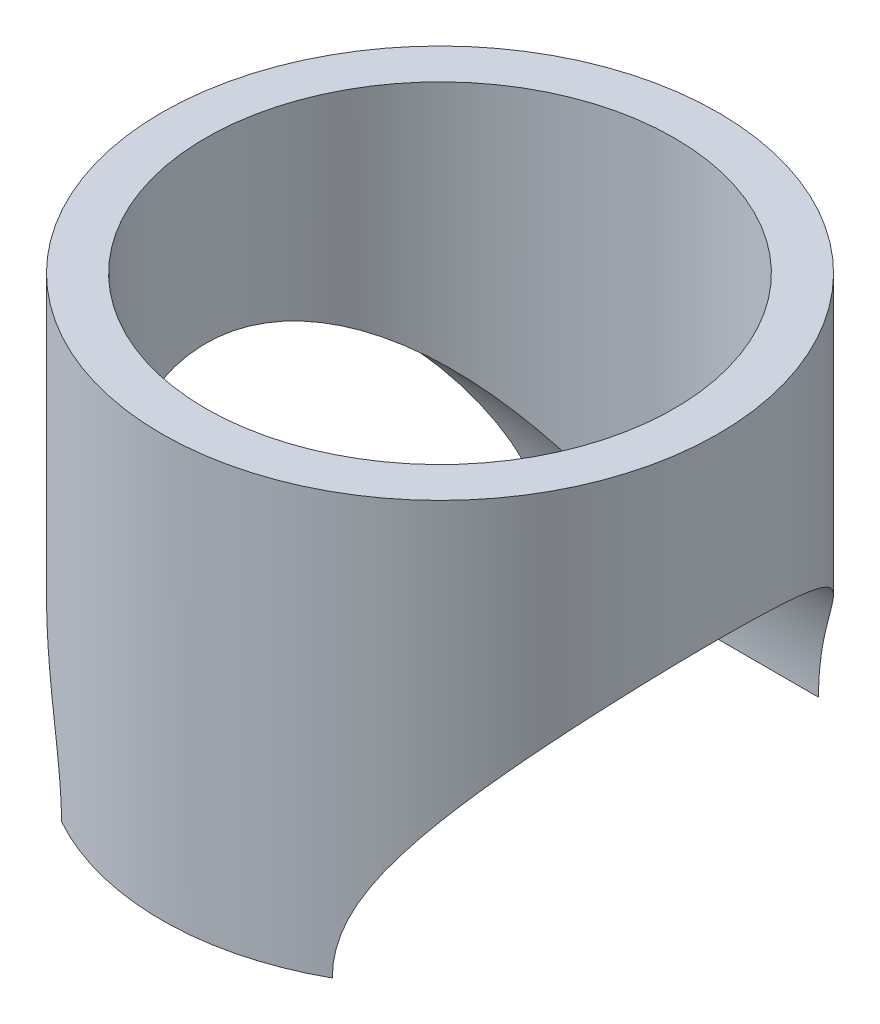
ISO-10303-21;
HEADER;
FILE_DESCRIPTION(('STEP AP214'),'2;1');
FILE_NAME('part.step','',(''),(''),'','','');
FILE_SCHEMA(('AUTOMOTIVE_DESIGN { 1 0 10303 214 1 1 1 1 }'));
ENDSEC;
DATA;
#1=APPLICATION_CONTEXT('core data for automotive mechanical design processes');
#2=APPLICATION_PROTOCOL_DEFINITION('international standard','automotive_design',2000,#1);
#3=PRODUCT_CONTEXT('',#1,'mechanical');
#4=PRODUCT('Part','Part','',(#3));
#5=PRODUCT_RELATED_PRODUCT_CATEGORY('part','',(#4));
#6=PRODUCT_DEFINITION_FORMATION('','',#4);
#7=PRODUCT_DEFINITION_CONTEXT('part definition',#1,'design');
#8=PRODUCT_DEFINITION('design','',#6,#7);
#9=PRODUCT_DEFINITION_SHAPE('','',#8);
#10=(LENGTH_UNIT() NAMED_UNIT(*) SI_UNIT(.MILLI.,.METRE.));
#11=(NAMED_UNIT(*) PLANE_ANGLE_UNIT() SI_UNIT($,.RADIAN.));
#12=(NAMED_UNIT(*) SI_UNIT($,.STERADIAN.) SOLID_ANGLE_UNIT());
#13=UNCERTAINTY_MEASURE_WITH_UNIT(LENGTH_MEASURE(1.E-05),#10,'distance_accuracy_value','');
#14=(GEOMETRIC_REPRESENTATION_CONTEXT(3) GLOBAL_UNCERTAINTY_ASSIGNED_CONTEXT((#13)) GLOBAL_UNIT_ASSIGNED_CONTEXT((#10,
#11,#12)) REPRESENTATION_CONTEXT('',''));
#15=CARTESIAN_POINT('',(0.,0.,0.));
#16=DIRECTION('',(0.,0.,1.));
#17=DIRECTION('',(1.,0.,0.));
#18=AXIS2_PLACEMENT_3D('',#15,#16,#17);
#19=CARTESIAN_POINT('',(0.,-18.25625,0.));
#20=DIRECTION('',(0.,1.,0.));
#21=DIRECTION('',(0.,0.,1.));
#22=AXIS2_PLACEMENT_3D('',#19,#20,#21);
#23=PLANE('',#22);
#24=CARTESIAN_POINT('',(0.,-18.25625,0.));
#25=DIRECTION('',(0.,1.,0.));
#26=DIRECTION('',(0.,0.,1.));
#27=AXIS2_PLACEMENT_3D('',#24,#25,#26);
#28=CIRCLE('',#27,24.13);
#29=CARTESIAN_POINT('',(11.739087528424,-18.25625,-21.082));
#30=VERTEX_POINT('',#29);
#31=CARTESIAN_POINT('',(-11.739087528424,-18.25625,-21.082));
#32=VERTEX_POINT('',#31);
#33=EDGE_CURVE('E56',#30,#32,#28,.T.);
#34=ORIENTED_EDGE('',*,*,#33,.F.);
#35=DIRECTION('',(1.,0.,0.));
#36=VECTOR('',#35,1.);
#37=CARTESIAN_POINT('',(0.,-18.25625,-21.082));
#38=LINE('',#37,#36);
#39=EDGE_CURVE('E69',#30,#32,#38,.F.);
#40=ORIENTED_EDGE('',*,*,#39,.T.);
#41=EDGE_LOOP('',(#34,#40));
#42=FACE_BOUND('',#41,.T.);
#43=ADVANCED_FACE('F35',(#42),#23,.F.);
#44=CARTESIAN_POINT('',(0.,18.25625,0.));
#45=DIRECTION('',(0.,1.,0.));
#46=DIRECTION('',(0.,0.,1.));
#47=AXIS2_PLACEMENT_3D('',#44,#45,#46);
#48=PLANE('',#47);
#49=CARTESIAN_POINT('',(0.,18.25625,0.));
#50=DIRECTION('',(0.,1.,0.));
#51=DIRECTION('',(0.,0.,1.));
#52=AXIS2_PLACEMENT_3D('',#49,#50,#51);
#53=CIRCLE('',#52,24.13);
#54=CARTESIAN_POINT('',(0.,18.25625,24.13));
#55=VERTEX_POINT('',#54);
#56=EDGE_CURVE('E49',#55,#55,#53,.T.);
#57=ORIENTED_EDGE('',*,*,#56,.T.);
#58=EDGE_LOOP('',(#57));
#59=FACE_BOUND('',#58,.T.);
#60=CARTESIAN_POINT('',(0.,18.25625,0.));
#61=DIRECTION('',(0.,1.,0.));
#62=DIRECTION('',(0.,0.,1.));
#63=AXIS2_PLACEMENT_3D('',#60,#61,#62);
#64=CIRCLE('',#63,20.32);
#65=CARTESIAN_POINT('',(0.,18.25625,20.32));
#66=VERTEX_POINT('',#65);
#67=EDGE_CURVE('E80',#66,#66,#64,.T.);
#68=ORIENTED_EDGE('',*,*,#67,.F.);
#69=EDGE_LOOP('',(#68));
#70=FACE_BOUND('',#69,.T.);
#71=ADVANCED_FACE('F105',(#59,#70),#48,.T.);
#72=DIRECTION('',(1.,0.,0.));
#73=VECTOR('',#72,1.);
#74=CARTESIAN_POINT('',(0.,-18.25625,21.082));
#75=LINE('',#74,#73);
#76=CARTESIAN_POINT('',(-11.739087528424,-18.25625,21.082));
#77=VERTEX_POINT('',#76);
#78=CARTESIAN_POINT('',(11.739087528424,-18.25625,21.082));
#79=VERTEX_POINT('',#78);
#80=EDGE_CURVE('E63',#77,#79,#75,.T.);
#81=ORIENTED_EDGE('',*,*,#80,.T.);
#82=EDGE_CURVE('E78',#77,#79,#28,.T.);
#83=ORIENTED_EDGE('',*,*,#82,.F.);
#84=EDGE_LOOP('',(#81,#83));
#85=FACE_BOUND('',#84,.T.);
#86=ADVANCED_FACE('F107',(#85),#23,.F.);
#87=CARTESIAN_POINT('',(0.,18.25625,0.));
#88=DIRECTION('',(0.,-1.,0.));
#89=DIRECTION('',(0.,0.,-1.));
#90=AXIS2_PLACEMENT_3D('',#87,#88,#89);
#91=CYLINDRICAL_SURFACE('',#90,24.13);
#92=ORIENTED_EDGE('',*,*,#56,.F.);
#93=EDGE_LOOP('',(#92));
#94=FACE_BOUND('',#93,.T.);
#95=ORIENTED_EDGE('',*,*,#82,.T.);
#96=CARTESIAN_POINT('',(11.739087528424,-18.25625,21.082));
#97=CARTESIAN_POINT('',(11.7390735991911,-18.08407407303,21.0820033956179));
#98=CARTESIAN_POINT('',(11.7428775245086,-17.9119284080734,21.0798900670036));
#99=CARTESIAN_POINT('',(11.7579884747208,-17.5680994761874,21.0714669377096));
#100=CARTESIAN_POINT('',(11.7692941595323,-17.3964161321697,21.0651578865359));
#101=CARTESIAN_POINT('',(11.8141910028188,-16.8834391279661,21.040034025855));
#102=CARTESIAN_POINT('',(11.8587633128905,-16.543341097433,21.0150221015338));
#103=CARTESIAN_POINT('',(11.9737048677594,-15.8750339752899,20.9497376890227));
#104=CARTESIAN_POINT('',(12.0436335160157,-15.5467212428461,20.909725468668));
#105=CARTESIAN_POINT('',(12.2060359880762,-14.8976845627344,20.8153404861012));
#106=CARTESIAN_POINT('',(12.2985245072683,-14.5769657116835,20.7609583614737));
#107=CARTESIAN_POINT('',(12.5484251271962,-13.8013732186979,20.6112485337628));
#108=CARTESIAN_POINT('',(12.7162968837642,-13.3513025005434,20.5085195345175));
#109=CARTESIAN_POINT('',(13.0814490845255,-12.4701267720358,20.2775553309992));
#110=CARTESIAN_POINT('',(13.2787435684613,-12.039030943883,20.14930794021));
#111=CARTESIAN_POINT('',(13.6961533726555,-11.1911359828143,19.8679700881986));
#112=CARTESIAN_POINT('',(13.9164644077948,-10.7745077303363,19.714659039238));
#113=CARTESIAN_POINT('',(14.3715808518282,-9.95861330201741,19.3853933315258));
#114=CARTESIAN_POINT('',(14.6063854155648,-9.55934611611482,19.2094399924607));
#115=CARTESIAN_POINT('',(15.0351878436054,-8.85888917974106,18.8747921840822));
#116=CARTESIAN_POINT('',(15.2274436243599,-8.55465866664908,18.7201903507985));
#117=CARTESIAN_POINT('',(15.615749993839,-7.95589421440815,18.3975278906171));
#118=CARTESIAN_POINT('',(15.8118009645401,-7.66136125943689,18.2294659035912));
#119=CARTESIAN_POINT('',(16.4031186599564,-6.79162031883522,17.7051357024082));
#120=CARTESIAN_POINT('',(16.8014559261532,-6.23042092901618,17.3287955231726));
#121=CARTESIAN_POINT('',(17.5935759198042,-5.14657597181105,16.5239648376673));
#122=CARTESIAN_POINT('',(17.9873679374965,-4.62383191492748,16.0956155727483));
#123=CARTESIAN_POINT('',(18.7620280565222,-3.61689060282745,15.1855208236601));
#124=CARTESIAN_POINT('',(19.142901838275,-3.13267627581971,14.7037992166734));
#125=CARTESIAN_POINT('',(19.7979937394125,-2.31259208230997,13.8033060115728));
#126=CARTESIAN_POINT('',(20.0766187768359,-1.96819152161001,13.3954826047861));
#127=CARTESIAN_POINT('',(20.6170322702882,-1.30655085934945,12.5478087141213));
#128=CARTESIAN_POINT('',(20.8788211700136,-0.989310041952961,12.1079590749085));
#129=CARTESIAN_POINT('',(21.3811440106904,-0.385177021028827,11.1970391769103));
#130=CARTESIAN_POINT('',(21.6217005084017,-0.0982525447157852,10.7260030044625));
#131=CARTESIAN_POINT('',(21.9634627085038,0.306959834283379,9.99676525436779));
#132=CARTESIAN_POINT('',(22.074200527265,0.437830046209029,9.7499160274075));
#133=CARTESIAN_POINT('',(22.2888283168124,0.690786093225204,9.24874897262869));
#134=CARTESIAN_POINT('',(22.3927165090234,0.812869647518544,8.99442922960148));
#135=CARTESIAN_POINT('',(22.6557598724382,1.12124272779861,8.31719373048579));
#136=CARTESIAN_POINT('',(22.8088160044349,1.29990149644173,7.88836839092437));
#137=CARTESIAN_POINT('',(23.0928338791217,1.63042748467382,7.01351531469732));
#138=CARTESIAN_POINT('',(23.2238001390804,1.78230018217138,6.56749111808858));
#139=CARTESIAN_POINT('',(23.4613695200211,2.05715593136349,5.66044959105592));
#140=CARTESIAN_POINT('',(23.5679822167315,2.1801503384237,5.19943823525703));
#141=CARTESIAN_POINT('',(23.7548637062547,2.39538979797867,4.26501387511208));
#142=CARTESIAN_POINT('',(23.8351322079308,2.48763451065056,3.791600733773));
#143=CARTESIAN_POINT('',(23.9680076717743,2.64017622817548,2.83315766499687));
#144=CARTESIAN_POINT('',(24.0204651423892,2.70030059076089,2.34807932105807));
#145=CARTESIAN_POINT('',(24.0958936412044,2.78671462776825,1.37262187745551));
#146=CARTESIAN_POINT('',(24.1188646023565,2.81300422525463,0.882242765741078));
#147=CARTESIAN_POINT('',(24.1347883831059,2.83123097137466,-0.0995719725427617));
#148=CARTESIAN_POINT('',(24.1277454676267,2.82317300074236,-0.59100743908707));
#149=CARTESIAN_POINT('',(24.0838129836678,2.77287321380192,-1.57075843632448));
#150=CARTESIAN_POINT('',(24.046924979396,2.730633189006,-2.05907412917589));
#151=CARTESIAN_POINT('',(23.9485083643139,2.61779042171497,-2.98747550538334));
#152=CARTESIAN_POINT('',(23.8893296033681,2.54989091094967,-3.42814511096225));
#153=CARTESIAN_POINT('',(23.7477698443778,2.38719943436388,-4.30065532684726));
#154=CARTESIAN_POINT('',(23.6653904470208,2.29240932381025,-4.73249654404878));
#155=CARTESIAN_POINT('',(23.4788321311074,2.07727528630051,-5.58495844876746));
#156=CARTESIAN_POINT('',(23.3746515218667,1.95692937748145,-6.00557826321081));
#157=CARTESIAN_POINT('',(23.1461387876345,1.69223427108215,-6.83356769686585));
#158=CARTESIAN_POINT('',(23.0218054185968,1.54788359165367,-7.24093649621643));
#159=CARTESIAN_POINT('',(22.7456021652489,1.2261398431218,-8.0683039057928));
#160=CARTESIAN_POINT('',(22.5924274017339,1.04715813372704,-8.48724779671844));
#161=CARTESIAN_POINT('',(22.2673789975177,0.665693744031697,-9.30672224437815));
#162=CARTESIAN_POINT('',(22.0955050238618,0.463210645265515,-9.70725247306132));
#163=CARTESIAN_POINT('',(21.7352637750987,0.0366060825356913,-10.4890666599843));
#164=CARTESIAN_POINT('',(21.5468908942153,-0.187522738595435,-10.8703440068291));
#165=CARTESIAN_POINT('',(21.1559090574181,-0.655600764159128,-11.6129492644716));
#166=CARTESIAN_POINT('',(20.9532971606271,-0.899554064707212,-11.9742730264431));
#167=CARTESIAN_POINT('',(20.4283285028445,-1.53627061071713,-12.857822369502));
#168=CARTESIAN_POINT('',(20.0981131136747,-1.94088524276709,-13.3669087963575));
#169=CARTESIAN_POINT('',(19.4171168179919,-2.78751979392966,-14.3382207585271));
#170=CARTESIAN_POINT('',(19.0663264434196,-3.22955697604914,-14.8004244483688));
#171=CARTESIAN_POINT('',(18.3504579632687,-4.14892420714467,-15.6792711924517));
#172=CARTESIAN_POINT('',(17.9853453799674,-4.62634223806346,-16.0957938142865));
#173=CARTESIAN_POINT('',(17.2492225520943,-5.6135470593565,-16.882271969802));
#174=CARTESIAN_POINT('',(16.878213912849,-6.1233251484868,-17.2522399423612));
#175=CARTESIAN_POINT('',(16.1928125714475,-7.0981656749566,-17.8951682454679));
#176=CARTESIAN_POINT('',(15.878076524012,-7.55886167034416,-18.1744024144448));
#177=CARTESIAN_POINT('',(15.256825362399,-8.5047407678277,-18.698968527221));
#178=CARTESIAN_POINT('',(14.9503124668056,-8.98993037848372,-18.944291394521));
#179=CARTESIAN_POINT('',(14.3546359423477,-9.98531509123404,-19.3995164604927));
#180=CARTESIAN_POINT('',(14.065432574079,-10.495447614902,-19.6095019682124));
#181=CARTESIAN_POINT('',(13.6529179816347,-11.2816261140679,-19.8968072202025));
#182=CARTESIAN_POINT('',(13.5190022183166,-11.5470911566672,-19.9879379518083));
#183=CARTESIAN_POINT('',(13.2600944866233,-12.0853732702324,-20.1606308855133));
#184=CARTESIAN_POINT('',(13.1351041264938,-12.3581916540404,-20.2421913648677));
#185=CARTESIAN_POINT('',(12.747458743117,-13.2557469080203,-20.490487427798));
#186=CARTESIAN_POINT('',(12.5067493342205,-13.8965014440883,-20.6371170384919));
#187=CARTESIAN_POINT('',(12.2101050282709,-14.8830900866602,-20.8130643312883));
#188=CARTESIAN_POINT('',(12.1220620285236,-15.2155691231136,-20.8643271503547));
#189=CARTESIAN_POINT('',(11.9710882109104,-15.888124681314,-20.9513124087923));
#190=CARTESIAN_POINT('',(11.9081413380531,-16.2281961983066,-20.9870447849298));
#191=CARTESIAN_POINT('',(11.8199438741503,-16.8489697363104,-21.0368249538532));
#192=CARTESIAN_POINT('',(11.7898196611475,-17.1287570685328,-21.0536932955336));
#193=CARTESIAN_POINT('',(11.7492929221813,-17.6910754620512,-21.0763171033168));
#194=CARTESIAN_POINT('',(11.7389525984072,-17.9736123790282,-21.0820375204629));
#195=CARTESIAN_POINT('',(11.739087528424,-18.25625,-21.082));
#196=B_SPLINE_CURVE_WITH_KNOTS('',3,(#96,#97,#98,#99,#100,#101,#102,#103,#104,#105,#106,#107,
#108,#109,#110,#111,#112,#113,#114,#115,#116,#117,#118,#119,#120,#121,#122,#123,#124,#125,#126,
#127,#128,#129,#130,#131,#132,#133,#134,#135,#136,#137,#138,#139,#140,#141,#142,#143,#144,#145,
#146,#147,#148,#149,#150,#151,#152,#153,#154,#155,#156,#157,#158,#159,#160,#161,#162,#163,#164,
#165,#166,#167,#168,#169,#170,#171,#172,#173,#174,#175,#176,#177,#178,#179,#180,#181,#182,#183,
#184,#185,#186,#187,#188,#189,#190,#191,#192,#193,#194,#195),.UNSPECIFIED.,.F.,.F.,(4,2,2,2,2,2,
2,2,2,2,2,2,2,2,2,2,2,2,2,2,2,2,2,2,2,2,2,2,2,2,2,2,2,2,2,2,2,2,2,2,2,2,2,2,2,2,2,2,2,4),(0.,
0.516414774766779,1.03273732417139,2.06276206676861,3.07568518591108,4.08926988849761,
5.56045256298501,7.03233950631079,8.51795690508985,10.0034877551208,11.1781755276448,
12.3529821507218,14.7031691082531,17.0471107031818,19.390007891152,21.1948722669283,
22.9996890581353,24.802564780825,25.7039285991681,26.6055255514872,28.071339885437,
29.5368541032964,31.0017910908485,32.4667442672644,33.9394940960529,35.4122472736656,
36.8847911824043,38.3572579187905,39.7050947911592,41.0528386946392,42.4006871544234,
43.7486188496975,45.1891451440145,46.6296970922703,48.0707404047464,49.5120822250155,
51.6968835037557,53.8826981801523,56.0741435666265,58.2650021746245,60.1353967072175,
62.0062908932544,63.8727106398916,64.8053050988661,65.7380671778323,67.829964425309,
68.8721351756851,69.9136381339799,70.7584804344512,71.6059746520517),.UNSPECIFIED.);
#197=EDGE_CURVE('E72',#79,#30,#196,.T.);
#198=ORIENTED_EDGE('',*,*,#197,.T.);
#199=ORIENTED_EDGE('',*,*,#33,.T.);
#200=CARTESIAN_POINT('',(-11.739087528424,-18.25625,-21.082));
#201=CARTESIAN_POINT('',(-11.7390735991911,-18.08407407303,-21.0820033956179));
#202=CARTESIAN_POINT('',(-11.7428775245086,-17.9119284080734,-21.0798900670036));
#203=CARTESIAN_POINT('',(-11.7579884747208,-17.5680994761874,-21.0714669377096));
#204=CARTESIAN_POINT('',(-11.7692941595323,-17.3964161321697,-21.0651578865359));
#205=CARTESIAN_POINT('',(-11.8141910028188,-16.8834391279661,-21.040034025855));
#206=CARTESIAN_POINT('',(-11.8587633128905,-16.543341097433,-21.0150221015338));
#207=CARTESIAN_POINT('',(-11.9737048677594,-15.8750339752899,-20.9497376890227));
#208=CARTESIAN_POINT('',(-12.0436335160157,-15.5467212428461,-20.909725468668));
#209=CARTESIAN_POINT('',(-12.2060359880762,-14.8976845627344,-20.8153404861012));
#210=CARTESIAN_POINT('',(-12.2985245072683,-14.5769657116835,-20.7609583614737));
#211=CARTESIAN_POINT('',(-12.5484251271962,-13.8013732186979,-20.6112485337628));
#212=CARTESIAN_POINT('',(-12.7162968837642,-13.3513025005434,-20.5085195345175));
#213=CARTESIAN_POINT('',(-13.0814490845255,-12.4701267720358,-20.2775553309992));
#214=CARTESIAN_POINT('',(-13.2787435684613,-12.039030943883,-20.14930794021));
#215=CARTESIAN_POINT('',(-13.6961533726555,-11.1911359828143,-19.8679700881986));
#216=CARTESIAN_POINT('',(-13.9164644077948,-10.7745077303363,-19.714659039238));
#217=CARTESIAN_POINT('',(-14.3715808518282,-9.95861330201741,-19.3853933315258));
#218=CARTESIAN_POINT('',(-14.6063854155648,-9.55934611611482,-19.2094399924607));
#219=CARTESIAN_POINT('',(-15.0351878436054,-8.85888917974106,-18.8747921840822));
#220=CARTESIAN_POINT('',(-15.2274436243599,-8.55465866664908,-18.7201903507985));
#221=CARTESIAN_POINT('',(-15.615749993839,-7.95589421440815,-18.3975278906171));
#222=CARTESIAN_POINT('',(-15.8118009645401,-7.66136125943689,-18.2294659035912));
#223=CARTESIAN_POINT('',(-16.4031186599564,-6.79162031883522,-17.7051357024082));
#224=CARTESIAN_POINT('',(-16.8014559261532,-6.23042092901618,-17.3287955231726));
#225=CARTESIAN_POINT('',(-17.5935759198042,-5.14657597181105,-16.5239648376673));
#226=CARTESIAN_POINT('',(-17.9873679374965,-4.62383191492748,-16.0956155727483));
#227=CARTESIAN_POINT('',(-18.7620280565222,-3.61689060282745,-15.1855208236601));
#228=CARTESIAN_POINT('',(-19.142901838275,-3.13267627581971,-14.7037992166734));
#229=CARTESIAN_POINT('',(-19.7979937394125,-2.31259208230997,-13.8033060115728));
#230=CARTESIAN_POINT('',(-20.0766187768359,-1.96819152161001,-13.3954826047861));
#231=CARTESIAN_POINT('',(-20.6170322702882,-1.30655085934945,-12.5478087141213));
#232=CARTESIAN_POINT('',(-20.8788211700136,-0.989310041952961,-12.1079590749085));
#233=CARTESIAN_POINT('',(-21.3811440106904,-0.385177021028827,-11.1970391769103));
#234=CARTESIAN_POINT('',(-21.6217005084017,-0.0982525447157852,-10.7260030044625));
#235=CARTESIAN_POINT('',(-21.9634627085038,0.306959834283379,-9.99676525436779));
#236=CARTESIAN_POINT('',(-22.074200527265,0.437830046209029,-9.7499160274075));
#237=CARTESIAN_POINT('',(-22.2888283168124,0.690786093225204,-9.24874897262869));
#238=CARTESIAN_POINT('',(-22.3927165090234,0.812869647518544,-8.99442922960148));
#239=CARTESIAN_POINT('',(-22.6557598724382,1.12124272779861,-8.31719373048579));
#240=CARTESIAN_POINT('',(-22.8088160044349,1.29990149644173,-7.88836839092437));
#241=CARTESIAN_POINT('',(-23.0928338791217,1.63042748467382,-7.01351531469732));
#242=CARTESIAN_POINT('',(-23.2238001390804,1.78230018217138,-6.56749111808858));
#243=CARTESIAN_POINT('',(-23.4613695200211,2.05715593136349,-5.66044959105592));
#244=CARTESIAN_POINT('',(-23.5679822167315,2.1801503384237,-5.19943823525703));
#245=CARTESIAN_POINT('',(-23.7548637062547,2.39538979797867,-4.26501387511208));
#246=CARTESIAN_POINT('',(-23.8351322079308,2.48763451065056,-3.791600733773));
#247=CARTESIAN_POINT('',(-23.9680076717743,2.64017622817548,-2.83315766499687));
#248=CARTESIAN_POINT('',(-24.0204651423892,2.70030059076089,-2.34807932105807));
#249=CARTESIAN_POINT('',(-24.0958936412044,2.78671462776825,-1.37262187745551));
#250=CARTESIAN_POINT('',(-24.1188646023565,2.81300422525463,-0.882242765741078));
#251=CARTESIAN_POINT('',(-24.1347883831059,2.83123097137466,0.0995719725427617));
#252=CARTESIAN_POINT('',(-24.1277454676267,2.82317300074236,0.59100743908707));
#253=CARTESIAN_POINT('',(-24.0838129836678,2.77287321380192,1.57075843632448));
#254=CARTESIAN_POINT('',(-24.046924979396,2.730633189006,2.05907412917589));
#255=CARTESIAN_POINT('',(-23.9485083643139,2.61779042171497,2.98747550538334));
#256=CARTESIAN_POINT('',(-23.8893296033681,2.54989091094967,3.42814511096225));
#257=CARTESIAN_POINT('',(-23.7477698443778,2.38719943436388,4.30065532684726));
#258=CARTESIAN_POINT('',(-23.6653904470208,2.29240932381025,4.73249654404878));
#259=CARTESIAN_POINT('',(-23.4788321311074,2.07727528630051,5.58495844876746));
#260=CARTESIAN_POINT('',(-23.3746515218667,1.95692937748145,6.00557826321081));
#261=CARTESIAN_POINT('',(-23.1461387876345,1.69223427108215,6.83356769686585));
#262=CARTESIAN_POINT('',(-23.0218054185968,1.54788359165367,7.24093649621643));
#263=CARTESIAN_POINT('',(-22.7456021652489,1.2261398431218,8.0683039057928));
#264=CARTESIAN_POINT('',(-22.5924274017339,1.04715813372704,8.48724779671844));
#265=CARTESIAN_POINT('',(-22.2673789975177,0.665693744031697,9.30672224437815));
#266=CARTESIAN_POINT('',(-22.0955050238618,0.463210645265515,9.70725247306132));
#267=CARTESIAN_POINT('',(-21.7352637750987,0.0366060825356913,10.4890666599843));
#268=CARTESIAN_POINT('',(-21.5468908942153,-0.187522738595435,10.8703440068291));
#269=CARTESIAN_POINT('',(-21.1559090574181,-0.655600764159128,11.6129492644716));
#270=CARTESIAN_POINT('',(-20.9532971606271,-0.899554064707212,11.9742730264431));
#271=CARTESIAN_POINT('',(-20.4283285028445,-1.53627061071713,12.857822369502));
#272=CARTESIAN_POINT('',(-20.0981131136747,-1.94088524276709,13.3669087963575));
#273=CARTESIAN_POINT('',(-19.4171168179919,-2.78751979392966,14.3382207585271));
#274=CARTESIAN_POINT('',(-19.0663264434196,-3.22955697604914,14.8004244483688));
#275=CARTESIAN_POINT('',(-18.3504579632687,-4.14892420714467,15.6792711924517));
#276=CARTESIAN_POINT('',(-17.9853453799674,-4.62634223806346,16.0957938142865));
#277=CARTESIAN_POINT('',(-17.2492225520943,-5.6135470593565,16.882271969802));
#278=CARTESIAN_POINT('',(-16.878213912849,-6.1233251484868,17.2522399423612));
#279=CARTESIAN_POINT('',(-16.1928125714475,-7.0981656749566,17.8951682454679));
#280=CARTESIAN_POINT('',(-15.878076524012,-7.55886167034416,18.1744024144448));
#281=CARTESIAN_POINT('',(-15.256825362399,-8.5047407678277,18.698968527221));
#282=CARTESIAN_POINT('',(-14.9503124668056,-8.98993037848372,18.944291394521));
#283=CARTESIAN_POINT('',(-14.3546359423477,-9.98531509123404,19.3995164604927));
#284=CARTESIAN_POINT('',(-14.065432574079,-10.495447614902,19.6095019682124));
#285=CARTESIAN_POINT('',(-13.6529179816347,-11.2816261140679,19.8968072202025));
#286=CARTESIAN_POINT('',(-13.5190022183166,-11.5470911566672,19.9879379518083));
#287=CARTESIAN_POINT('',(-13.2600944866233,-12.0853732702324,20.1606308855133));
#288=CARTESIAN_POINT('',(-13.1351041264938,-12.3581916540404,20.2421913648677));
#289=CARTESIAN_POINT('',(-12.747458743117,-13.2557469080203,20.490487427798));
#290=CARTESIAN_POINT('',(-12.5067493342205,-13.8965014440883,20.6371170384919));
#291=CARTESIAN_POINT('',(-12.2101050282709,-14.8830900866602,20.8130643312883));
#292=CARTESIAN_POINT('',(-12.1220620285236,-15.2155691231136,20.8643271503547));
#293=CARTESIAN_POINT('',(-11.9710882109104,-15.888124681314,20.9513124087923));
#294=CARTESIAN_POINT('',(-11.9081413380531,-16.2281961983066,20.9870447849298));
#295=CARTESIAN_POINT('',(-11.8199438741503,-16.8489697363104,21.0368249538532));
#296=CARTESIAN_POINT('',(-11.7898196611475,-17.1287570685328,21.0536932955336));
#297=CARTESIAN_POINT('',(-11.7492929221813,-17.6910754620512,21.0763171033168));
#298=CARTESIAN_POINT('',(-11.7389525984072,-17.9736123790282,21.0820375204629));
#299=CARTESIAN_POINT('',(-11.739087528424,-18.25625,21.082));
#300=B_SPLINE_CURVE_WITH_KNOTS('',3,(#200,#201,#202,#203,#204,#205,#206,#207,#208,#209,#210,
#211,#212,#213,#214,#215,#216,#217,#218,#219,#220,#221,#222,#223,#224,#225,#226,#227,#228,#229,
#230,#231,#232,#233,#234,#235,#236,#237,#238,#239,#240,#241,#242,#243,#244,#245,#246,#247,#248,
#249,#250,#251,#252,#253,#254,#255,#256,#257,#258,#259,#260,#261,#262,#263,#264,#265,#266,#267,
#268,#269,#270,#271,#272,#273,#274,#275,#276,#277,#278,#279,#280,#281,#282,#283,#284,#285,#286,
#287,#288,#289,#290,#291,#292,#293,#294,#295,#296,#297,#298,#299),.UNSPECIFIED.,.F.,.F.,(4,2,2,
2,2,2,2,2,2,2,2,2,2,2,2,2,2,2,2,2,2,2,2,2,2,2,2,2,2,2,2,2,2,2,2,2,2,2,2,2,2,2,2,2,2,2,2,2,2,4),
(0.,0.516414774766779,1.03273732417139,2.06276206676861,3.07568518591108,4.08926988849761,
5.56045256298501,7.03233950631079,8.51795690508985,10.0034877551208,11.1781755276448,
12.3529821507218,14.7031691082531,17.0471107031818,19.390007891152,21.1948722669283,
22.9996890581353,24.802564780825,25.7039285991681,26.6055255514872,28.071339885437,
29.5368541032964,31.0017910908485,32.4667442672644,33.9394940960529,35.4122472736656,
36.8847911824043,38.3572579187905,39.7050947911592,41.0528386946392,42.4006871544234,
43.7486188496975,45.1891451440145,46.6296970922703,48.0707404047464,49.5120822250155,
51.6968835037557,53.8826981801523,56.0741435666265,58.2650021746245,60.1353967072175,
62.0062908932544,63.8727106398916,64.8053050988661,65.7380671778323,67.829964425309,
68.8721351756851,69.9136381339799,70.7584804344512,71.6059746520517),.UNSPECIFIED.);
#301=EDGE_CURVE('E73',#32,#77,#300,.T.);
#302=ORIENTED_EDGE('',*,*,#301,.T.);
#303=EDGE_LOOP('',(#95,#198,#199,#302));
#304=FACE_BOUND('',#303,.T.);
#305=ADVANCED_FACE('F37',(#94,#304),#91,.T.);
#306=CARTESIAN_POINT('',(0.,18.25625,0.));
#307=DIRECTION('',(0.,-1.,0.));
#308=DIRECTION('',(0.,0.,-1.));
#309=AXIS2_PLACEMENT_3D('',#306,#307,#308);
#310=CYLINDRICAL_SURFACE('',#309,20.32);
#311=CARTESIAN_POINT('',(0.,-12.6394605255761,-20.32));
#312=CARTESIAN_POINT('',(-0.184417417974767,-12.6394619019347,-20.3200002606694));
#313=CARTESIAN_POINT('',(-0.368829240780096,-12.6303181397513,-20.3174797464156));
#314=CARTESIAN_POINT('',(-0.735755044605389,-12.5944273212818,-20.3075063282795));
#315=CARTESIAN_POINT('',(-0.918268849772865,-12.567678648393,-20.3000529714296));
#316=CARTESIAN_POINT('',(-1.46211042045118,-12.4631860121443,-20.2705809180041));
#317=CARTESIAN_POINT('',(-1.81847995875847,-12.3612134345082,-20.2414528663234));
#318=CARTESIAN_POINT('',(-2.44969099295465,-12.1343174735069,-20.1738410029329));
#319=CARTESIAN_POINT('',(-2.72768518212068,-12.016798410833,-20.1379747535897));
#320=CARTESIAN_POINT('',(-3.27228928450342,-11.7602004245639,-20.0566754646791));
#321=CARTESIAN_POINT('',(-3.53888863748094,-11.6211020320621,-20.0112337727357));
#322=CARTESIAN_POINT('',(-4.06279408315517,-11.3275166888492,-19.9114918481958));
#323=CARTESIAN_POINT('',(-4.32006606467843,-11.1729797646717,-19.857162459618));
#324=CARTESIAN_POINT('',(-4.82598863281761,-10.8535403759254,-19.7403031602825));
#325=CARTESIAN_POINT('',(-5.07464190207152,-10.6886411824688,-19.6777758307078));
#326=CARTESIAN_POINT('',(-5.61110777913172,-10.3197499393006,-19.532256912199));
#327=CARTESIAN_POINT('',(-5.89744038342538,-10.1142592694743,-19.4476310577278));
#328=CARTESIAN_POINT('',(-6.46176543144866,-9.69664606176831,-19.2674775135538));
#329=CARTESIAN_POINT('',(-6.73975609042764,-9.48452212425399,-19.1719475116272));
#330=CARTESIAN_POINT('',(-7.28874849223839,-9.05599309878468,-18.9700327622342));
#331=CARTESIAN_POINT('',(-7.55974488755073,-8.83958494634641,-18.8636400005617));
#332=CARTESIAN_POINT('',(-8.09533824154419,-8.4044194245839,-18.6400661126524));
#333=CARTESIAN_POINT('',(-8.35993461073448,-8.1856618415188,-18.5228839973764));
#334=CARTESIAN_POINT('',(-9.14485614510763,-7.52804124389511,-18.1551158882365));
#335=CARTESIAN_POINT('',(-9.65645512101587,-7.08771797988564,-17.8882559386435));
#336=CARTESIAN_POINT('',(-10.6576028478083,-6.21154772164822,-17.3104464394853));
#337=CARTESIAN_POINT('',(-11.1471607536951,-5.77569892806979,-16.9995154221488));
#338=CARTESIAN_POINT('',(-12.093164403356,-4.9238976111927,-16.3396066952305));
#339=CARTESIAN_POINT('',(-12.5501073158894,-4.50771807067916,-15.9916423689944));
#340=CARTESIAN_POINT('',(-13.2178553114513,-3.89476240752689,-15.4361420262537));
#341=CARTESIAN_POINT('',(-13.4375126804218,-3.69231163272043,-15.245364132466));
#342=CARTESIAN_POINT('',(-13.8706609222317,-3.2917335905789,-14.8523642620018));
#343=CARTESIAN_POINT('',(-14.0841494168222,-3.09360799771644,-14.6501379583033));
#344=CARTESIAN_POINT('',(-14.7139003784012,-2.50748571774826,-14.0268355897561));
#345=CARTESIAN_POINT('',(-15.120266213253,-2.12699067858719,-13.5884593320207));
#346=CARTESIAN_POINT('',(-15.9018875749204,-1.3920657060148,-12.6648371183912));
#347=CARTESIAN_POINT('',(-16.2771559847739,-1.03762498576567,-12.1796107537675));
#348=CARTESIAN_POINT('',(-16.8934596093329,-0.453709469179471,-11.3012065318532));
#349=CARTESIAN_POINT('',(-17.1431331110622,-0.216572919605269,-10.9191581442352));
#350=CARTESIAN_POINT('',(-17.6207243318259,0.237880280873775,-10.1303980434832));
#351=CARTESIAN_POINT('',(-17.8486437164111,0.455198449067648,-9.7236882223967));
#352=CARTESIAN_POINT('',(-18.2797572549343,0.86687109700068,-8.88674550324429));
#353=CARTESIAN_POINT('',(-18.4829740288266,1.06124658034271,-8.4565346562131));
#354=CARTESIAN_POINT('',(-18.8619396668621,1.42414919543712,-7.57365626895639));
#355=CARTESIAN_POINT('',(-19.0376925267468,1.59268008726829,-7.12099200814045));
#356=CARTESIAN_POINT('',(-19.3342040014815,1.87726219254343,-6.26604364988622));
#357=CARTESIAN_POINT('',(-19.4592619306066,1.9973971947559,-5.8666066613227));
#358=CARTESIAN_POINT('',(-19.6856896244314,2.21504022995331,-5.05504009024362));
#359=CARTESIAN_POINT('',(-19.7870616883833,2.31255045918105,-4.64291174411265));
#360=CARTESIAN_POINT('',(-19.9644670104148,2.48326988849953,-3.80845301074774));
#361=CARTESIAN_POINT('',(-20.0405108931257,2.55648927802772,-3.38612698116023));
#362=CARTESIAN_POINT('',(-20.1659928441528,2.67734276175507,-2.53389474380582));
#363=CARTESIAN_POINT('',(-20.2154306244937,2.72497657902467,-2.10398845404477));
#364=CARTESIAN_POINT('',(-20.2868960424269,2.79384223719538,-1.23833656851701));
#365=CARTESIAN_POINT('',(-20.3088318841162,2.81498565835861,-0.80257629806259));
#366=CARTESIAN_POINT('',(-20.3245635654344,2.83014854660544,0.0699275142370868));
#367=CARTESIAN_POINT('',(-20.3183593707468,2.82416798061169,0.506671057280781));
#368=CARTESIAN_POINT('',(-20.2779320096456,2.78520483913035,1.37766601124881));
#369=CARTESIAN_POINT('',(-20.2437070672037,2.75222055207639,1.81191726244824));
#370=CARTESIAN_POINT('',(-20.1478925100936,2.65990958836411,2.67453830819819));
#371=CARTESIAN_POINT('',(-20.0863032366482,2.60058324018128,3.10290817601866));
#372=CARTESIAN_POINT('',(-19.9406604621129,2.46035921734366,3.92932071023734));
#373=CARTESIAN_POINT('',(-19.8578962132195,2.38070002068302,4.32780346663534));
#374=CARTESIAN_POINT('',(-19.6699877997052,2.19994917159982,5.11444125906626));
#375=CARTESIAN_POINT('',(-19.5648450605255,2.09885888427351,5.50259695113068));
#376=CARTESIAN_POINT('',(-19.3336199945227,1.87671194699303,6.26681324533769));
#377=CARTESIAN_POINT('',(-19.2075340887837,1.7556518844871,6.64287176709703));
#378=CARTESIAN_POINT('',(-18.9359949259391,1.49517420498538,7.38142123941378));
#379=CARTESIAN_POINT('',(-18.7905377766887,1.35575289884044,7.74390944457042));
#380=CARTESIAN_POINT('',(-18.4230128636173,1.00386247103155,8.58958277244538));
#381=CARTESIAN_POINT('',(-18.1928721065152,0.783801584866496,9.0661299740245));
#382=CARTESIAN_POINT('',(-17.7027608366545,0.316060218004689,9.98939772110448));
#383=CARTESIAN_POINT('',(-17.4427811194754,0.0683712155328585,10.4361089955357));
#384=CARTESIAN_POINT('',(-16.8962961510647,-0.451028651050392,11.2995155173916));
#385=CARTESIAN_POINT('',(-16.6097456135166,-0.722780490079615,11.7161572842663));
#386=CARTESIAN_POINT('',(-16.0138409648839,-1.28621682917446,12.5183470177444));
#387=CARTESIAN_POINT('',(-15.7044864294472,-1.57790170015999,12.9038944054429));
#388=CARTESIAN_POINT('',(-14.9498648705224,-2.28676661456996,13.7785312387024));
#389=CARTESIAN_POINT('',(-14.4960020034565,-2.71108870676215,14.2544489125096));
#390=CARTESIAN_POINT('',(-13.5566859501954,-3.58309569953304,15.1505897511677));
#391=CARTESIAN_POINT('',(-13.071218887872,-4.03079084495821,15.5707882026938));
#392=CARTESIAN_POINT('',(-12.0723701419288,-4.94276645247577,16.3574051526222));
#393=CARTESIAN_POINT('',(-11.5589684814955,-5.4070587000227,16.7237844519108));
#394=CARTESIAN_POINT('',(-10.5068124086764,-6.34474698990341,17.4040767989496));
#395=CARTESIAN_POINT('',(-9.96806710485529,-6.81813972587044,17.7180085146238));
#396=CARTESIAN_POINT('',(-9.05744475815976,-7.60016768141796,18.1942032056478));
#397=CARTESIAN_POINT('',(-8.69299174241924,-7.90861082702446,18.371148039684));
#398=CARTESIAN_POINT('',(-7.95212427970901,-8.5227242824924,18.7037722251653));
#399=CARTESIAN_POINT('',(-7.57570847144346,-8.8283942716606,18.8594491456886));
#400=CARTESIAN_POINT('',(-6.80970423852603,-9.43216347574923,19.1493590573222));
#401=CARTESIAN_POINT('',(-6.4201367484271,-9.73027351174013,19.283624345782));
#402=CARTESIAN_POINT('',(-5.8231456028714,-10.1668018999906,19.4688636232259));
#403=CARTESIAN_POINT('',(-5.62207575387877,-10.3105159944147,19.5279086199211));
#404=CARTESIAN_POINT('',(-5.21507376451691,-10.5931049390919,19.6405198693077));
#405=CARTESIAN_POINT('',(-5.00914222582211,-10.7319803829559,19.694086795626));
#406=CARTESIAN_POINT('',(-4.60007486105584,-10.9977490101039,19.7935394049732));
#407=CARTESIAN_POINT('',(-4.39716142567918,-11.1248995666483,19.839647792221));
#408=CARTESIAN_POINT('',(-3.98541381802482,-11.3711506774771,19.9264436965042));
#409=CARTESIAN_POINT('',(-3.77658104835329,-11.4902531165262,19.9671324849221));
#410=CARTESIAN_POINT('',(-3.35203381973312,-11.7177196112121,20.0427719146334));
#411=CARTESIAN_POINT('',(-3.13631930198481,-11.8260835750637,20.0777225068823));
#412=CARTESIAN_POINT('',(-2.69744123301836,-12.0283732060862,20.1413878508368));
#413=CARTESIAN_POINT('',(-2.47427974006974,-12.1223028231898,20.1701043093926));
#414=CARTESIAN_POINT('',(-1.88793259677985,-12.3399755236353,20.2353128883276));
#415=CARTESIAN_POINT('',(-1.51841644557882,-12.4495378430395,20.266695122651));
#416=CARTESIAN_POINT('',(-0.953897457208559,-12.5620215000821,20.298472438678));
#417=CARTESIAN_POINT('',(-0.764389465225233,-12.5908667920678,20.3065146725284));
#418=CARTESIAN_POINT('',(-0.383252049691645,-12.6295839249008,20.3172778508392));
#419=CARTESIAN_POINT('',(-0.191623004374876,-12.6394590954402,20.3199997291457));
#420=CARTESIAN_POINT('',(0.184417417974766,-12.6394619019347,20.3200002606694));
#421=CARTESIAN_POINT('',(0.368829240780097,-12.6303181397513,20.3174797464156));
#422=CARTESIAN_POINT('',(0.735755044605392,-12.5944273212818,20.3075063282795));
#423=CARTESIAN_POINT('',(0.91826884977287,-12.567678648393,20.3000529714296));
#424=CARTESIAN_POINT('',(1.46211042045118,-12.4631860121443,20.2705809180041));
#425=CARTESIAN_POINT('',(1.81847995875847,-12.3612134345082,20.2414528663234));
#426=CARTESIAN_POINT('',(2.44969099295465,-12.1343174735069,20.1738410029329));
#427=CARTESIAN_POINT('',(2.72768518212068,-12.016798410833,20.1379747535897));
#428=CARTESIAN_POINT('',(3.27228928450342,-11.7602004245639,20.0566754646791));
#429=CARTESIAN_POINT('',(3.53888863748095,-11.6211020320621,20.0112337727357));
#430=CARTESIAN_POINT('',(4.06279408315517,-11.3275166888492,19.9114918481958));
#431=CARTESIAN_POINT('',(4.32006606467843,-11.1729797646717,19.857162459618));
#432=CARTESIAN_POINT('',(4.82598863281761,-10.8535403759254,19.7403031602825));
#433=CARTESIAN_POINT('',(5.07464190207153,-10.6886411824688,19.6777758307078));
#434=CARTESIAN_POINT('',(5.61110777913172,-10.3197499393006,19.532256912199));
#435=CARTESIAN_POINT('',(5.89744038342538,-10.1142592694743,19.4476310577278));
#436=CARTESIAN_POINT('',(6.46176543144866,-9.69664606176831,19.2674775135538));
#437=CARTESIAN_POINT('',(6.73975609042764,-9.48452212425399,19.1719475116272));
#438=CARTESIAN_POINT('',(7.2887484922384,-9.05599309878468,18.9700327622342));
#439=CARTESIAN_POINT('',(7.55974488755074,-8.83958494634641,18.8636400005617));
#440=CARTESIAN_POINT('',(8.0953382415442,-8.4044194245839,18.6400661126524));
#441=CARTESIAN_POINT('',(8.35993461073449,-8.1856618415188,18.5228839973764));
#442=CARTESIAN_POINT('',(9.14485614510764,-7.52804124389511,18.1551158882364));
#443=CARTESIAN_POINT('',(9.65645512101587,-7.08771797988563,17.8882559386435));
#444=CARTESIAN_POINT('',(10.6576028478083,-6.21154772164821,17.3104464394853));
#445=CARTESIAN_POINT('',(11.1471607536951,-5.77569892806979,16.9995154221488));
#446=CARTESIAN_POINT('',(12.093164403356,-4.9238976111927,16.3396066952305));
#447=CARTESIAN_POINT('',(12.5501073158894,-4.50771807067916,15.9916423689944));
#448=CARTESIAN_POINT('',(13.2178553114513,-3.8947624075269,15.4361420262537));
#449=CARTESIAN_POINT('',(13.4375126804218,-3.69231163272043,15.245364132466));
#450=CARTESIAN_POINT('',(13.8706609222317,-3.29173359057891,14.8523642620018));
#451=CARTESIAN_POINT('',(14.0841494168222,-3.09360799771644,14.6501379583033));
#452=CARTESIAN_POINT('',(14.7139003784012,-2.50748571774826,14.0268355897561));
#453=CARTESIAN_POINT('',(15.120266213253,-2.12699067858719,13.5884593320207));
#454=CARTESIAN_POINT('',(15.9018875749204,-1.3920657060148,12.6648371183912));
#455=CARTESIAN_POINT('',(16.2771559847739,-1.03762498576567,12.1796107537675));
#456=CARTESIAN_POINT('',(16.8934596093329,-0.453709469179471,11.3012065318532));
#457=CARTESIAN_POINT('',(17.1431331110622,-0.216572919605268,10.9191581442352));
#458=CARTESIAN_POINT('',(17.6207243318259,0.237880280873776,10.1303980434832));
#459=CARTESIAN_POINT('',(17.8486437164111,0.455198449067648,9.7236882223967));
#460=CARTESIAN_POINT('',(18.2797572549343,0.86687109700068,8.88674550324429));
#461=CARTESIAN_POINT('',(18.4829740288266,1.06124658034271,8.4565346562131));
#462=CARTESIAN_POINT('',(18.8619396668621,1.42414919543713,7.57365626895638));
#463=CARTESIAN_POINT('',(19.0376925267468,1.59268008726829,7.12099200814045));
#464=CARTESIAN_POINT('',(19.3342040014815,1.87726219254343,6.26604364988622));
#465=CARTESIAN_POINT('',(19.4592619306066,1.9973971947559,5.8666066613227));
#466=CARTESIAN_POINT('',(19.6856896244314,2.21504022995332,5.05504009024362));
#467=CARTESIAN_POINT('',(19.7870616883833,2.31255045918105,4.64291174411264));
#468=CARTESIAN_POINT('',(19.9644670104148,2.48326988849953,3.80845301074773));
#469=CARTESIAN_POINT('',(20.0405108931257,2.55648927802772,3.38612698116023));
#470=CARTESIAN_POINT('',(20.1659928441528,2.67734276175507,2.53389474380582));
#471=CARTESIAN_POINT('',(20.2154306244937,2.72497657902467,2.10398845404477));
#472=CARTESIAN_POINT('',(20.2868960424269,2.79384223719538,1.23833656851701));
#473=CARTESIAN_POINT('',(20.3088318841162,2.81498565835861,0.802576298062589));
#474=CARTESIAN_POINT('',(20.3245635654344,2.83014854660544,-0.0699275142370893));
#475=CARTESIAN_POINT('',(20.3183593707468,2.82416798061169,-0.506671057280784));
#476=CARTESIAN_POINT('',(20.2779320096456,2.78520483913035,-1.37766601124881));
#477=CARTESIAN_POINT('',(20.2437070672037,2.75222055207639,-1.81191726244824));
#478=CARTESIAN_POINT('',(20.1478925100936,2.65990958836411,-2.67453830819819));
#479=CARTESIAN_POINT('',(20.0863032366482,2.60058324018128,-3.10290817601866));
#480=CARTESIAN_POINT('',(19.9406604621129,2.46035921734366,-3.92932071023734));
#481=CARTESIAN_POINT('',(19.8578962132195,2.38070002068302,-4.32780346663534));
#482=CARTESIAN_POINT('',(19.6699877997052,2.19994917159982,-5.11444125906626));
#483=CARTESIAN_POINT('',(19.5648450605255,2.09885888427351,-5.50259695113067));
#484=CARTESIAN_POINT('',(19.3336199945227,1.87671194699303,-6.26681324533768));
#485=CARTESIAN_POINT('',(19.2075340887837,1.75565188448711,-6.64287176709703));
#486=CARTESIAN_POINT('',(18.9359949259391,1.49517420498539,-7.38142123941378));
#487=CARTESIAN_POINT('',(18.7905377766887,1.35575289884044,-7.74390944457042));
#488=CARTESIAN_POINT('',(18.4230128636173,1.00386247103155,-8.58958277244537));
#489=CARTESIAN_POINT('',(18.1928721065152,0.783801584866498,-9.06612997402449));
#490=CARTESIAN_POINT('',(17.7027608366545,0.31606021800469,-9.98939772110447));
#491=CARTESIAN_POINT('',(17.4427811194754,0.068371215532858,-10.4361089955357));
#492=CARTESIAN_POINT('',(16.8962961510647,-0.451028651050393,-11.2995155173916));
#493=CARTESIAN_POINT('',(16.6097456135166,-0.722780490079614,-11.7161572842663));
#494=CARTESIAN_POINT('',(16.0138409648839,-1.28621682917445,-12.5183470177444));
#495=CARTESIAN_POINT('',(15.7044864294472,-1.57790170015999,-12.9038944054429));
#496=CARTESIAN_POINT('',(14.9498648705224,-2.28676661456996,-13.7785312387024));
#497=CARTESIAN_POINT('',(14.4960020034565,-2.71108870676215,-14.2544489125096));
#498=CARTESIAN_POINT('',(13.5566859501954,-3.58309569953304,-15.1505897511677));
#499=CARTESIAN_POINT('',(13.071218887872,-4.03079084495821,-15.5707882026938));
#500=CARTESIAN_POINT('',(12.0723701419288,-4.94276645247577,-16.3574051526222));
#501=CARTESIAN_POINT('',(11.5589684814955,-5.40705870002271,-16.7237844519109));
#502=CARTESIAN_POINT('',(10.5068124086764,-6.34474698990342,-17.4040767989496));
#503=CARTESIAN_POINT('',(9.96806710485528,-6.81813972587044,-17.7180085146238));
#504=CARTESIAN_POINT('',(9.05744475815976,-7.60016768141796,-18.1942032056478));
#505=CARTESIAN_POINT('',(8.69299174241924,-7.90861082702446,-18.371148039684));
#506=CARTESIAN_POINT('',(7.95212427970901,-8.5227242824924,-18.7037722251653));
#507=CARTESIAN_POINT('',(7.57570847144346,-8.8283942716606,-18.8594491456886));
#508=CARTESIAN_POINT('',(6.80970423852603,-9.43216347574923,-19.1493590573222));
#509=CARTESIAN_POINT('',(6.42013674842711,-9.73027351174014,-19.283624345782));
#510=CARTESIAN_POINT('',(5.8231456028714,-10.1668018999906,-19.4688636232259));
#511=CARTESIAN_POINT('',(5.62207575387876,-10.3105159944147,-19.5279086199211));
#512=CARTESIAN_POINT('',(5.2150737645169,-10.5931049390919,-19.6405198693077));
#513=CARTESIAN_POINT('',(5.00914222582211,-10.7319803829559,-19.694086795626));
#514=CARTESIAN_POINT('',(4.60007486105584,-10.9977490101039,-19.7935394049732));
#515=CARTESIAN_POINT('',(4.39716142567917,-11.1248995666483,-19.839647792221));
#516=CARTESIAN_POINT('',(3.98541381802482,-11.3711506774771,-19.9264436965042));
#517=CARTESIAN_POINT('',(3.77658104835329,-11.4902531165263,-19.9671324849221));
#518=CARTESIAN_POINT('',(3.35203381973312,-11.7177196112121,-20.0427719146334));
#519=CARTESIAN_POINT('',(3.13631930198481,-11.8260835750637,-20.0777225068823));
#520=CARTESIAN_POINT('',(2.69744123301836,-12.0283732060862,-20.1413878508368));
#521=CARTESIAN_POINT('',(2.47427974006974,-12.1223028231898,-20.1701043093926));
#522=CARTESIAN_POINT('',(1.88793259677985,-12.3399755236353,-20.2353128883276));
#523=CARTESIAN_POINT('',(1.51841644557882,-12.4495378430396,-20.266695122651));
#524=CARTESIAN_POINT('',(0.953897457208551,-12.5620215000821,-20.298472438678));
#525=CARTESIAN_POINT('',(0.764389465225229,-12.5908667920678,-20.3065146725284));
#526=CARTESIAN_POINT('',(0.383252049691643,-12.6295839249008,-20.3172778508392));
#527=CARTESIAN_POINT('',(0.191623004374875,-12.6394590954402,-20.3199997291457));
#528=CARTESIAN_POINT('',(0.,-12.6394605255761,-20.32));
#529=B_SPLINE_CURVE_WITH_KNOTS('',3,(#311,#312,#313,#314,#315,#316,#317,#318,#319,#320,#321,
#322,#323,#324,#325,#326,#327,#328,#329,#330,#331,#332,#333,#334,#335,#336,#337,#338,#339,#340,
#341,#342,#343,#344,#345,#346,#347,#348,#349,#350,#351,#352,#353,#354,#355,#356,#357,#358,#359,
#360,#361,#362,#363,#364,#365,#366,#367,#368,#369,#370,#371,#372,#373,#374,#375,#376,#377,#378,
#379,#380,#381,#382,#383,#384,#385,#386,#387,#388,#389,#390,#391,#392,#393,#394,#395,#396,#397,
#398,#399,#400,#401,#402,#403,#404,#405,#406,#407,#408,#409,#410,#411,#412,#413,#414,#415,#416,
#417,#418,#419,#420,#421,#422,#423,#424,#425,#426,#427,#428,#429,#430,#431,#432,#433,#434,#435,
#436,#437,#438,#439,#440,#441,#442,#443,#444,#445,#446,#447,#448,#449,#450,#451,#452,#453,#454,
#455,#456,#457,#458,#459,#460,#461,#462,#463,#464,#465,#466,#467,#468,#469,#470,#471,#472,#473,
#474,#475,#476,#477,#478,#479,#480,#481,#482,#483,#484,#485,#486,#487,#488,#489,#490,#491,#492,
#493,#494,#495,#496,#497,#498,#499,#500,#501,#502,#503,#504,#505,#506,#507,#508,#509,#510,#511,
#512,#513,#514,#515,#516,#517,#518,#519,#520,#521,#522,#523,#524,#525,#526,#527,#528),
.UNSPECIFIED.,.T.,.F.,(4,2,2,2,2,2,2,2,2,2,2,2,2,2,2,2,2,2,2,2,2,2,2,2,2,2,2,2,2,2,2,2,2,2,2,2,
2,2,2,2,2,2,2,2,2,2,2,2,2,2,2,2,2,2,2,2,2,2,2,2,2,2,2,2,2,2,2,2,2,2,2,2,2,2,2,2,2,2,2,2,2,2,2,2,
2,2,2,2,2,2,2,2,2,2,2,2,2,2,2,2,2,2,2,2,2,2,2,2,4),(0.,0.552998517872616,1.10604782291699,
2.21585936160066,3.12647707544481,4.03792117983499,4.95241753936754,5.866626651268,
6.95360419514216,8.0408126622443,9.12882911475254,10.2169454031059,12.3926151297919,
14.5673726697376,16.6932013435948,17.756308322298,18.8198198291453,20.9429495938505,
23.0651953449257,24.6069002462107,26.1484870157903,27.6886513614228,29.2285914185542,
30.5336412638743,31.8385643717203,33.142939400761,34.44732854763,35.7560599898146,
37.0647930279801,38.3736090234861,39.6824086990127,40.9252170955293,42.1679463526485,
43.4108881950138,44.6540801518918,46.3709625866376,48.0883760585515,49.8087724006215,
51.5292007650715,53.8736990132848,56.219233670718,58.5664683138249,60.912865706052,
62.4399069928136,63.9671226745651,65.4920124547419,66.2542085611079,67.0163108288089,
67.7476669056006,68.4788511104216,69.2100415643676,69.9410315716988,71.0948358646945,
71.6695421111204,72.2441474741784,72.797145992051,73.3501952970954,74.460006835779,
75.3706245496232,76.2820686540134,77.1965650135459,78.1107741254464,79.1977516693205,
80.2849601364227,81.3729765889309,82.4610928772843,84.6367626039703,86.811520143916,
88.9373488177732,90.0004557964764,91.0639673033237,93.1870970680289,95.3093428191041,
96.8510477203891,98.3926344899686,99.9327988356012,101.472738892733,102.777788738053,
104.082711845899,105.387086874939,106.691476021808,108.000207463993,109.308940502158,
110.617756497664,111.926556173191,113.169364569708,114.412093826827,115.655035669192,
116.89822762607,118.615110060816,120.33252353273,122.0529198748,123.77334823925,
126.117846487463,128.463381144896,130.810615788003,133.15701318023,134.684054466992,
136.211270148744,137.73615992892,138.498356035286,139.260458302987,139.991814379779,
140.7229985846,141.454189038546,142.185179045877,143.338983338873,143.913689585299,
144.488294948357),.UNSPECIFIED.);
#530=CARTESIAN_POINT('',(0.,-12.6394605255761,-20.32));
#531=VERTEX_POINT('',#530);
#532=EDGE_CURVE('E11',#531,#531,#529,.T.);
#533=ORIENTED_EDGE('',*,*,#532,.F.);
#534=EDGE_LOOP('',(#533));
#535=FACE_BOUND('',#534,.T.);
#536=ORIENTED_EDGE('',*,*,#67,.T.);
#537=EDGE_LOOP('',(#536));
#538=FACE_BOUND('',#537,.T.);
#539=ADVANCED_FACE('F98',(#535,#538),#310,.F.);
#540=CARTESIAN_POINT('',(0.,-18.25625,0.));
#541=DIRECTION('',(1.,0.,0.));
#542=DIRECTION('',(0.,0.,-1.));
#543=AXIS2_PLACEMENT_3D('',#540,#541,#542);
#544=CYLINDRICAL_SURFACE('',#543,21.082);
#545=ORIENTED_EDGE('',*,*,#197,.F.);
#546=ORIENTED_EDGE('',*,*,#80,.F.);
#547=ORIENTED_EDGE('',*,*,#301,.F.);
#548=ORIENTED_EDGE('',*,*,#39,.F.);
#549=EDGE_LOOP('',(#545,#546,#547,#548));
#550=FACE_BOUND('',#549,.T.);
#551=ORIENTED_EDGE('',*,*,#532,.T.);
#552=EDGE_LOOP('',(#551));
#553=FACE_BOUND('',#552,.T.);
#554=ADVANCED_FACE('F70',(#550,#553),#544,.F.);
#555=CLOSED_SHELL('',(#43,#71,#86,#305,#539,#554));
#556=MANIFOLD_SOLID_BREP('B2',#555);
#557=ADVANCED_BREP_SHAPE_REPRESENTATION('',(#18,#556),#14);
#558=SHAPE_DEFINITION_REPRESENTATION(#9,#557);
ENDSEC;
END-ISO-10303-21;
